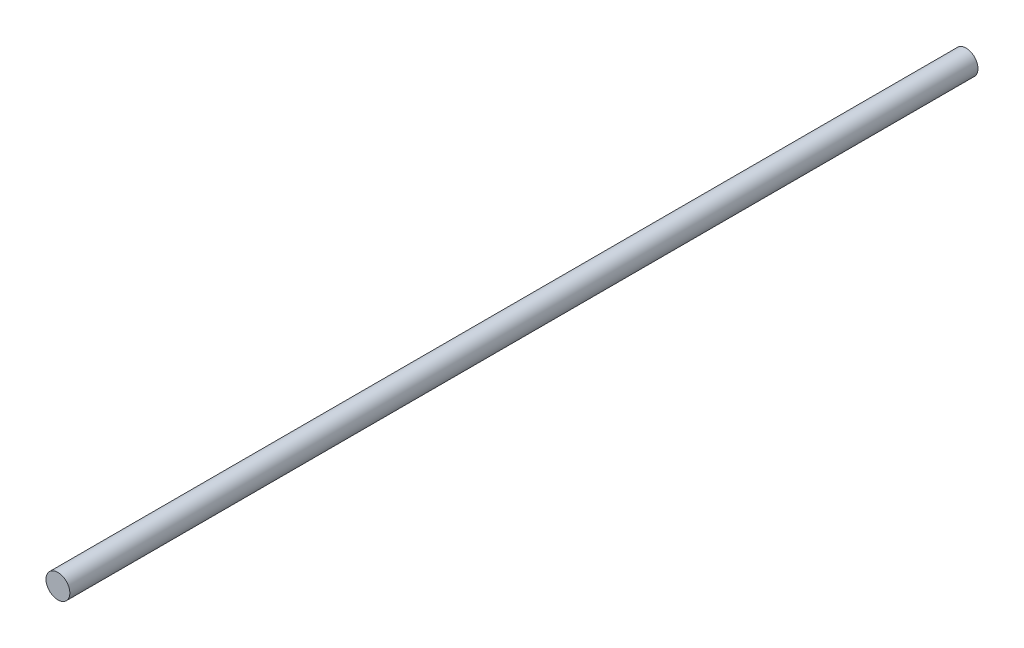
ISO-10303-21;
HEADER;
FILE_DESCRIPTION(('STEP AP214'),'2;1');
FILE_NAME('part.step','',(''),(''),'','','');
FILE_SCHEMA(('AUTOMOTIVE_DESIGN { 1 0 10303 214 1 1 1 1 }'));
ENDSEC;
DATA;
#1=APPLICATION_CONTEXT('core data for automotive mechanical design processes');
#2=APPLICATION_PROTOCOL_DEFINITION('international standard','automotive_design',2000,#1);
#3=PRODUCT_CONTEXT('',#1,'mechanical');
#4=PRODUCT('Part','Part','',(#3));
#5=PRODUCT_RELATED_PRODUCT_CATEGORY('part','',(#4));
#6=PRODUCT_DEFINITION_FORMATION('','',#4);
#7=PRODUCT_DEFINITION_CONTEXT('part definition',#1,'design');
#8=PRODUCT_DEFINITION('design','',#6,#7);
#9=PRODUCT_DEFINITION_SHAPE('','',#8);
#10=(LENGTH_UNIT() NAMED_UNIT(*) SI_UNIT(.MILLI.,.METRE.));
#11=(NAMED_UNIT(*) PLANE_ANGLE_UNIT() SI_UNIT($,.RADIAN.));
#12=(NAMED_UNIT(*) SI_UNIT($,.STERADIAN.) SOLID_ANGLE_UNIT());
#13=UNCERTAINTY_MEASURE_WITH_UNIT(LENGTH_MEASURE(1.E-05),#10,'distance_accuracy_value','');
#14=(GEOMETRIC_REPRESENTATION_CONTEXT(3) GLOBAL_UNCERTAINTY_ASSIGNED_CONTEXT((#13)) GLOBAL_UNIT_ASSIGNED_CONTEXT((#10,
#11,#12)) REPRESENTATION_CONTEXT('',''));
#15=CARTESIAN_POINT('',(0.,0.,0.));
#16=DIRECTION('',(0.,0.,1.));
#17=DIRECTION('',(1.,0.,0.));
#18=AXIS2_PLACEMENT_3D('',#15,#16,#17);
#19=CARTESIAN_POINT('',(0.,0.,300.7));
#20=DIRECTION('',(0.,0.,-1.));
#21=DIRECTION('',(-1.,0.,0.));
#22=AXIS2_PLACEMENT_3D('',#19,#20,#21);
#23=CYLINDRICAL_SURFACE('',#22,3.95);
#24=CARTESIAN_POINT('',(0.,0.,300.7));
#25=DIRECTION('',(0.,0.,1.));
#26=DIRECTION('',(1.,0.,0.));
#27=AXIS2_PLACEMENT_3D('',#24,#25,#26);
#28=CIRCLE('',#27,3.95);
#29=CARTESIAN_POINT('',(3.95,0.,300.7));
#30=VERTEX_POINT('',#29);
#31=EDGE_CURVE('E10',#30,#30,#28,.T.);
#32=ORIENTED_EDGE('',*,*,#31,.F.);
#33=EDGE_LOOP('',(#32));
#34=FACE_BOUND('',#33,.T.);
#35=CARTESIAN_POINT('',(0.,0.,0.));
#36=DIRECTION('',(0.,0.,1.));
#37=DIRECTION('',(1.,0.,0.));
#38=AXIS2_PLACEMENT_3D('',#35,#36,#37);
#39=CIRCLE('',#38,3.95);
#40=CARTESIAN_POINT('',(3.95,0.,0.));
#41=VERTEX_POINT('',#40);
#42=EDGE_CURVE('E36',#41,#41,#39,.T.);
#43=ORIENTED_EDGE('',*,*,#42,.T.);
#44=EDGE_LOOP('',(#43));
#45=FACE_BOUND('',#44,.T.);
#46=ADVANCED_FACE('F33',(#34,#45),#23,.T.);
#47=CARTESIAN_POINT('',(0.,0.,300.7));
#48=DIRECTION('',(0.,0.,1.));
#49=DIRECTION('',(1.,0.,0.));
#50=AXIS2_PLACEMENT_3D('',#47,#48,#49);
#51=PLANE('',#50);
#52=ORIENTED_EDGE('',*,*,#31,.T.);
#53=EDGE_LOOP('',(#52));
#54=FACE_BOUND('',#53,.T.);
#55=ADVANCED_FACE('F48',(#54),#51,.T.);
#56=CARTESIAN_POINT('',(0.,0.,0.));
#57=DIRECTION('',(0.,0.,1.));
#58=DIRECTION('',(1.,0.,0.));
#59=AXIS2_PLACEMENT_3D('',#56,#57,#58);
#60=PLANE('',#59);
#61=ORIENTED_EDGE('',*,*,#42,.F.);
#62=EDGE_LOOP('',(#61));
#63=FACE_BOUND('',#62,.T.);
#64=ADVANCED_FACE('F46',(#63),#60,.F.);
#65=CLOSED_SHELL('',(#46,#55,#64));
#66=MANIFOLD_SOLID_BREP('B2',#65);
#67=ADVANCED_BREP_SHAPE_REPRESENTATION('',(#18,#66),#14);
#68=SHAPE_DEFINITION_REPRESENTATION(#9,#67);
ENDSEC;
END-ISO-10303-21;
